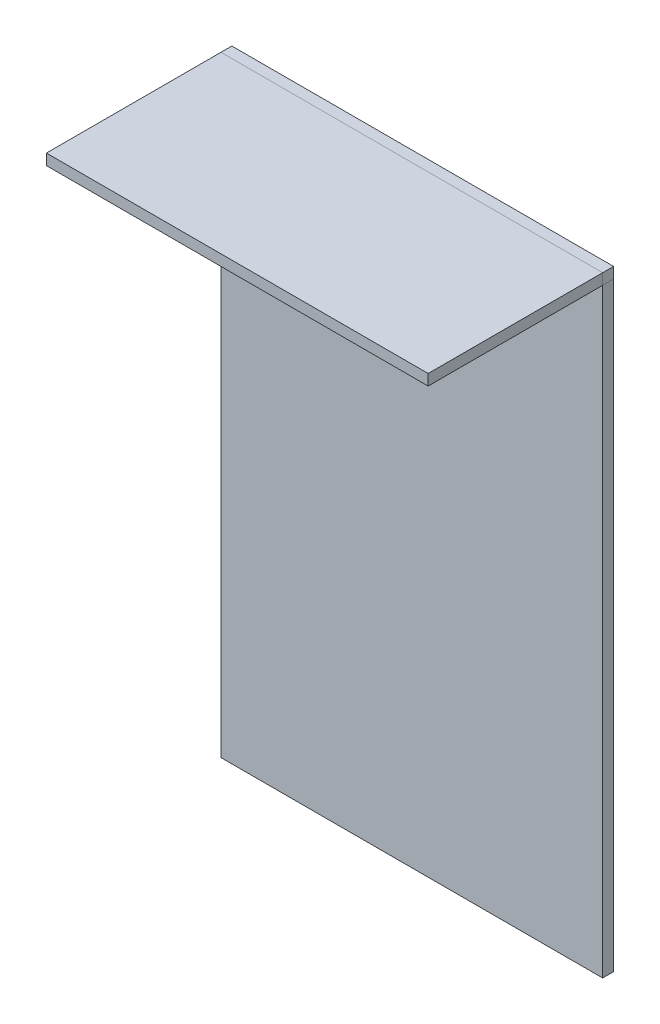
ISO-10303-21;
HEADER;
FILE_DESCRIPTION(('STEP AP214'),'2;1');
FILE_NAME('part.step','',(''),(''),'','','');
FILE_SCHEMA(('AUTOMOTIVE_DESIGN { 1 0 10303 214 1 1 1 1 }'));
ENDSEC;
DATA;
#1=APPLICATION_CONTEXT('core data for automotive mechanical design processes');
#2=APPLICATION_PROTOCOL_DEFINITION('international standard','automotive_design',2000,#1);
#3=PRODUCT_CONTEXT('',#1,'mechanical');
#4=PRODUCT('Part','Part','',(#3));
#5=PRODUCT_RELATED_PRODUCT_CATEGORY('part','',(#4));
#6=PRODUCT_DEFINITION_FORMATION('','',#4);
#7=PRODUCT_DEFINITION_CONTEXT('part definition',#1,'design');
#8=PRODUCT_DEFINITION('design','',#6,#7);
#9=PRODUCT_DEFINITION_SHAPE('','',#8);
#10=(LENGTH_UNIT() NAMED_UNIT(*) SI_UNIT(.MILLI.,.METRE.));
#11=(NAMED_UNIT(*) PLANE_ANGLE_UNIT() SI_UNIT($,.RADIAN.));
#12=(NAMED_UNIT(*) SI_UNIT($,.STERADIAN.) SOLID_ANGLE_UNIT());
#13=UNCERTAINTY_MEASURE_WITH_UNIT(LENGTH_MEASURE(1.E-05),#10,'distance_accuracy_value','');
#14=(GEOMETRIC_REPRESENTATION_CONTEXT(3) GLOBAL_UNCERTAINTY_ASSIGNED_CONTEXT((#13)) GLOBAL_UNIT_ASSIGNED_CONTEXT((#10,
#11,#12)) REPRESENTATION_CONTEXT('',''));
#15=CARTESIAN_POINT('',(0.,0.,0.));
#16=DIRECTION('',(0.,0.,1.));
#17=DIRECTION('',(1.,0.,0.));
#18=AXIS2_PLACEMENT_3D('',#15,#16,#17);
#19=CARTESIAN_POINT('',(51.627560854272,18.840471400111,0.));
#20=DIRECTION('',(1.74845552913497E-07,-0.999999999999985,0.));
#21=DIRECTION('',(0.,0.,-1.));
#22=AXIS2_PLACEMENT_3D('',#19,#20,#21);
#23=PLANE('',#22);
#24=DIRECTION('',(0.999999999999985,1.74845552913497E-07,0.));
#25=VECTOR('',#24,1.);
#26=CARTESIAN_POINT('',(51.627560854272,18.840471400111,0.17));
#27=LINE('',#26,#25);
#28=CARTESIAN_POINT('',(51.627560854272,18.840471400111,0.17));
#29=VERTEX_POINT('',#28);
#30=CARTESIAN_POINT('',(51.977560854272,18.840471461307,0.17));
#31=VERTEX_POINT('',#30);
#32=EDGE_CURVE('E11',#29,#31,#27,.T.);
#33=ORIENTED_EDGE('',*,*,#32,.T.);
#34=DIRECTION('',(0.,0.,-1.));
#35=VECTOR('',#34,1.);
#36=CARTESIAN_POINT('',(51.977560854272,18.840471461307,0.17));
#37=LINE('',#36,#35);
#38=CARTESIAN_POINT('',(51.977560854272,18.840471461307,0.01));
#39=VERTEX_POINT('',#38);
#40=EDGE_CURVE('E20',#31,#39,#37,.T.);
#41=ORIENTED_EDGE('',*,*,#40,.T.);
#42=DIRECTION('',(-0.999999999999985,-1.74845552913497E-07,0.));
#43=VECTOR('',#42,1.);
#44=CARTESIAN_POINT('',(51.977560854272,18.840471461307,0.01));
#45=LINE('',#44,#43);
#46=CARTESIAN_POINT('',(51.627560854272,18.840471400111,0.01));
#47=VERTEX_POINT('',#46);
#48=EDGE_CURVE('E186',#39,#47,#45,.T.);
#49=ORIENTED_EDGE('',*,*,#48,.T.);
#50=DIRECTION('',(0.,0.,1.));
#51=VECTOR('',#50,1.);
#52=CARTESIAN_POINT('',(51.627560854272,18.840471400111,0.));
#53=LINE('',#52,#51);
#54=EDGE_CURVE('E189',#47,#29,#53,.T.);
#55=ORIENTED_EDGE('',*,*,#54,.T.);
#56=EDGE_LOOP('',(#33,#41,#49,#55));
#57=FACE_BOUND('',#56,.T.);
#58=ADVANCED_FACE('F16',(#57),#23,.F.);
#59=CARTESIAN_POINT('',(51.627560856021,18.830471400111,0.17));
#60=DIRECTION('',(0.,0.,-1.));
#61=DIRECTION('',(0.,-1.,0.));
#62=AXIS2_PLACEMENT_3D('',#59,#60,#61);
#63=PLANE('',#62);
#64=DIRECTION('',(0.999999999999985,1.74845552913497E-07,0.));
#65=VECTOR('',#64,1.);
#66=CARTESIAN_POINT('',(51.627560856021,18.830471400111,0.17));
#67=LINE('',#66,#65);
#68=CARTESIAN_POINT('',(51.627560856021,18.830471400111,0.17));
#69=VERTEX_POINT('',#68);
#70=CARTESIAN_POINT('',(51.977560856021,18.830471461307,0.17));
#71=VERTEX_POINT('',#70);
#72=EDGE_CURVE('E108',#69,#71,#67,.T.);
#73=ORIENTED_EDGE('',*,*,#72,.T.);
#74=DIRECTION('',(-1.74845552913497E-07,0.999999999999985,0.));
#75=VECTOR('',#74,1.);
#76=CARTESIAN_POINT('',(51.977560856021,18.830471461307,0.17));
#77=LINE('',#76,#75);
#78=EDGE_CURVE('E27',#71,#31,#77,.T.);
#79=ORIENTED_EDGE('',*,*,#78,.T.);
#80=ORIENTED_EDGE('',*,*,#32,.F.);
#81=DIRECTION('',(-1.74845552913497E-07,0.999999999999985,0.));
#82=VECTOR('',#81,1.);
#83=CARTESIAN_POINT('',(51.627560856021,18.830471400111,0.17));
#84=LINE('',#83,#82);
#85=EDGE_CURVE('E158',#69,#29,#84,.T.);
#86=ORIENTED_EDGE('',*,*,#85,.F.);
#87=EDGE_LOOP('',(#73,#79,#80,#86));
#88=FACE_BOUND('',#87,.T.);
#89=ADVANCED_FACE('F18',(#88),#63,.F.);
#90=CARTESIAN_POINT('',(51.977560856021,18.830471461307,0.17));
#91=DIRECTION('',(-0.999999999999985,-1.74845552913497E-07,0.));
#92=DIRECTION('',(-1.74845552913497E-07,0.999999999999985,0.));
#93=AXIS2_PLACEMENT_3D('',#90,#91,#92);
#94=PLANE('',#93);
#95=DIRECTION('',(-1.74845552913497E-07,0.999999999999985,0.));
#96=VECTOR('',#95,1.);
#97=CARTESIAN_POINT('',(51.977560952186,18.280471461307,0.01));
#98=LINE('',#97,#96);
#99=CARTESIAN_POINT('',(51.977560856021,18.830471461307,0.01));
#100=VERTEX_POINT('',#99);
#101=EDGE_CURVE('E101',#100,#39,#98,.T.);
#102=ORIENTED_EDGE('',*,*,#101,.T.);
#103=ORIENTED_EDGE('',*,*,#40,.F.);
#104=ORIENTED_EDGE('',*,*,#78,.F.);
#105=DIRECTION('',(0.,0.,-1.));
#106=VECTOR('',#105,1.);
#107=CARTESIAN_POINT('',(51.977560856021,18.830471461307,0.17));
#108=LINE('',#107,#106);
#109=EDGE_CURVE('E97',#71,#100,#108,.T.);
#110=ORIENTED_EDGE('',*,*,#109,.T.);
#111=EDGE_LOOP('',(#102,#103,#104,#110));
#112=FACE_BOUND('',#111,.T.);
#113=ADVANCED_FACE('F99',(#112),#94,.F.);
#114=CARTESIAN_POINT('',(51.977560854272,18.840471461307,0.));
#115=DIRECTION('',(1.74845552913497E-07,-0.999999999999985,0.));
#116=DIRECTION('',(0.,0.,-1.));
#117=AXIS2_PLACEMENT_3D('',#114,#115,#116);
#118=PLANE('',#117);
#119=DIRECTION('',(-0.999999999999985,-1.74845552913497E-07,0.));
#120=VECTOR('',#119,1.);
#121=CARTESIAN_POINT('',(51.977560854272,18.840471461307,0.));
#122=LINE('',#121,#120);
#123=CARTESIAN_POINT('',(51.977560854272,18.840471461307,0.));
#124=VERTEX_POINT('',#123);
#125=CARTESIAN_POINT('',(51.627560854272,18.840471400111,0.));
#126=VERTEX_POINT('',#125);
#127=EDGE_CURVE('E120',#124,#126,#122,.T.);
#128=ORIENTED_EDGE('',*,*,#127,.T.);
#129=DIRECTION('',(0.,0.,1.));
#130=VECTOR('',#129,1.);
#131=CARTESIAN_POINT('',(51.627560854272,18.840471400111,0.));
#132=LINE('',#131,#130);
#133=EDGE_CURVE('E174',#126,#47,#132,.T.);
#134=ORIENTED_EDGE('',*,*,#133,.T.);
#135=ORIENTED_EDGE('',*,*,#48,.F.);
#136=DIRECTION('',(0.,0.,1.));
#137=VECTOR('',#136,1.);
#138=CARTESIAN_POINT('',(51.977560854272,18.840471461307,0.));
#139=LINE('',#138,#137);
#140=EDGE_CURVE('E118',#124,#39,#139,.T.);
#141=ORIENTED_EDGE('',*,*,#140,.F.);
#142=EDGE_LOOP('',(#128,#134,#135,#141));
#143=FACE_BOUND('',#142,.T.);
#144=ADVANCED_FACE('F235',(#143),#118,.F.);
#145=CARTESIAN_POINT('',(51.627560856021,18.830471400111,0.));
#146=DIRECTION('',(0.999999999999985,1.74845552913497E-07,0.));
#147=DIRECTION('',(0.,0.,-1.));
#148=AXIS2_PLACEMENT_3D('',#145,#146,#147);
#149=PLANE('',#148);
#150=ORIENTED_EDGE('',*,*,#85,.T.);
#151=ORIENTED_EDGE('',*,*,#54,.F.);
#152=DIRECTION('',(1.74845552913497E-07,-0.999999999999985,0.));
#153=VECTOR('',#152,1.);
#154=CARTESIAN_POINT('',(51.627560854272,18.840471400111,0.01));
#155=LINE('',#154,#153);
#156=CARTESIAN_POINT('',(51.627560856021,18.830471400111,0.01));
#157=VERTEX_POINT('',#156);
#158=EDGE_CURVE('E132',#47,#157,#155,.T.);
#159=ORIENTED_EDGE('',*,*,#158,.T.);
#160=DIRECTION('',(0.,0.,1.));
#161=VECTOR('',#160,1.);
#162=CARTESIAN_POINT('',(51.627560856021,18.830471400111,0.));
#163=LINE('',#162,#161);
#164=EDGE_CURVE('E109',#157,#69,#163,.T.);
#165=ORIENTED_EDGE('',*,*,#164,.T.);
#166=EDGE_LOOP('',(#150,#151,#159,#165));
#167=FACE_BOUND('',#166,.T.);
#168=ADVANCED_FACE('F204',(#167),#149,.F.);
#169=CARTESIAN_POINT('',(51.627560856021,18.830471400111,0.));
#170=DIRECTION('',(1.74845552913497E-07,-0.999999999999985,0.));
#171=DIRECTION('',(0.,0.,-1.));
#172=AXIS2_PLACEMENT_3D('',#169,#170,#171);
#173=PLANE('',#172);
#174=ORIENTED_EDGE('',*,*,#164,.F.);
#175=DIRECTION('',(-0.999999999999985,-1.74845552913497E-07,0.));
#176=VECTOR('',#175,1.);
#177=CARTESIAN_POINT('',(51.627560856021,18.830471400111,0.01));
#178=LINE('',#177,#176);
#179=EDGE_CURVE('E124',#100,#157,#178,.T.);
#180=ORIENTED_EDGE('',*,*,#179,.F.);
#181=ORIENTED_EDGE('',*,*,#109,.F.);
#182=ORIENTED_EDGE('',*,*,#72,.F.);
#183=EDGE_LOOP('',(#174,#180,#181,#182));
#184=FACE_BOUND('',#183,.T.);
#185=ADVANCED_FACE('F126',(#184),#173,.T.);
#186=CARTESIAN_POINT('',(51.627560854272,18.840471400111,0.));
#187=DIRECTION('',(0.,0.,-1.));
#188=DIRECTION('',(0.,-1.,0.));
#189=AXIS2_PLACEMENT_3D('',#186,#187,#188);
#190=PLANE('',#189);
#191=DIRECTION('',(-0.999999999999985,-1.74845552913497E-07,0.));
#192=VECTOR('',#191,1.);
#193=CARTESIAN_POINT('',(51.977560856021,18.830471461307,0.));
#194=LINE('',#193,#192);
#195=CARTESIAN_POINT('',(51.977560856021,18.830471461307,0.));
#196=VERTEX_POINT('',#195);
#197=CARTESIAN_POINT('',(51.627560856021,18.830471400111,0.));
#198=VERTEX_POINT('',#197);
#199=EDGE_CURVE('E133',#196,#198,#194,.T.);
#200=ORIENTED_EDGE('',*,*,#199,.T.);
#201=DIRECTION('',(-1.74845552913497E-07,0.999999999999985,0.));
#202=VECTOR('',#201,1.);
#203=CARTESIAN_POINT('',(51.627560856021,18.830471400111,0.));
#204=LINE('',#203,#202);
#205=EDGE_CURVE('E178',#198,#126,#204,.T.);
#206=ORIENTED_EDGE('',*,*,#205,.T.);
#207=ORIENTED_EDGE('',*,*,#127,.F.);
#208=DIRECTION('',(-1.74845552913497E-07,0.999999999999985,0.));
#209=VECTOR('',#208,1.);
#210=CARTESIAN_POINT('',(51.977560856021,18.830471461307,0.));
#211=LINE('',#210,#209);
#212=EDGE_CURVE('E179',#196,#124,#211,.T.);
#213=ORIENTED_EDGE('',*,*,#212,.F.);
#214=EDGE_LOOP('',(#200,#206,#207,#213));
#215=FACE_BOUND('',#214,.T.);
#216=ADVANCED_FACE('F237',(#215),#190,.T.);
#217=CARTESIAN_POINT('',(51.977560856021,18.830471461307,0.17));
#218=DIRECTION('',(-0.999999999999985,-1.74845552913497E-07,0.));
#219=DIRECTION('',(-1.74845552913497E-07,0.999999999999985,0.));
#220=AXIS2_PLACEMENT_3D('',#217,#218,#219);
#221=PLANE('',#220);
#222=ORIENTED_EDGE('',*,*,#212,.T.);
#223=ORIENTED_EDGE('',*,*,#140,.T.);
#224=ORIENTED_EDGE('',*,*,#101,.F.);
#225=DIRECTION('',(0.,0.,-1.));
#226=VECTOR('',#225,1.);
#227=CARTESIAN_POINT('',(51.977560856021,18.830471461307,0.17));
#228=LINE('',#227,#226);
#229=EDGE_CURVE('E116',#100,#196,#228,.T.);
#230=ORIENTED_EDGE('',*,*,#229,.T.);
#231=EDGE_LOOP('',(#222,#223,#224,#230));
#232=FACE_BOUND('',#231,.T.);
#233=ADVANCED_FACE('F114',(#232),#221,.F.);
#234=CARTESIAN_POINT('',(51.627560856021,18.830471400111,0.));
#235=DIRECTION('',(0.999999999999985,1.74845552913497E-07,0.));
#236=DIRECTION('',(0.,0.,-1.));
#237=AXIS2_PLACEMENT_3D('',#234,#235,#236);
#238=PLANE('',#237);
#239=ORIENTED_EDGE('',*,*,#158,.F.);
#240=ORIENTED_EDGE('',*,*,#133,.F.);
#241=ORIENTED_EDGE('',*,*,#205,.F.);
#242=DIRECTION('',(0.,0.,1.));
#243=VECTOR('',#242,1.);
#244=CARTESIAN_POINT('',(51.627560856021,18.830471400111,0.));
#245=LINE('',#244,#243);
#246=EDGE_CURVE('E155',#198,#157,#245,.T.);
#247=ORIENTED_EDGE('',*,*,#246,.T.);
#248=EDGE_LOOP('',(#239,#240,#241,#247));
#249=FACE_BOUND('',#248,.T.);
#250=ADVANCED_FACE('F207',(#249),#238,.F.);
#251=CARTESIAN_POINT('',(51.627560854272,18.840471400111,0.01));
#252=DIRECTION('',(0.,0.,-1.));
#253=DIRECTION('',(0.,-1.,0.));
#254=AXIS2_PLACEMENT_3D('',#251,#252,#253);
#255=PLANE('',#254);
#256=DIRECTION('',(0.999999999999985,1.74845552913497E-07,0.));
#257=VECTOR('',#256,1.);
#258=CARTESIAN_POINT('',(51.627560952186,18.280471400111,0.01));
#259=LINE('',#258,#257);
#260=CARTESIAN_POINT('',(51.627560952186,18.280471400111,0.01));
#261=VERTEX_POINT('',#260);
#262=CARTESIAN_POINT('',(51.977560952186,18.280471461307,0.01));
#263=VERTEX_POINT('',#262);
#264=EDGE_CURVE('E139',#261,#263,#259,.T.);
#265=ORIENTED_EDGE('',*,*,#264,.T.);
#266=DIRECTION('',(-1.74845552913497E-07,0.999999999999985,0.));
#267=VECTOR('',#266,1.);
#268=CARTESIAN_POINT('',(51.977560952186,18.280471461307,0.01));
#269=LINE('',#268,#267);
#270=EDGE_CURVE('E136',#263,#100,#269,.T.);
#271=ORIENTED_EDGE('',*,*,#270,.T.);
#272=ORIENTED_EDGE('',*,*,#179,.T.);
#273=DIRECTION('',(1.74845552913497E-07,-0.999999999999985,0.));
#274=VECTOR('',#273,1.);
#275=CARTESIAN_POINT('',(51.627560854272,18.840471400111,0.01));
#276=LINE('',#275,#274);
#277=EDGE_CURVE('E173',#157,#261,#276,.T.);
#278=ORIENTED_EDGE('',*,*,#277,.T.);
#279=EDGE_LOOP('',(#265,#271,#272,#278));
#280=FACE_BOUND('',#279,.T.);
#281=ADVANCED_FACE('F137',(#280),#255,.F.);
#282=CARTESIAN_POINT('',(51.627560854272,18.840471400111,0.));
#283=DIRECTION('',(0.,0.,-1.));
#284=DIRECTION('',(0.,-1.,0.));
#285=AXIS2_PLACEMENT_3D('',#282,#283,#284);
#286=PLANE('',#285);
#287=DIRECTION('',(1.74845552913497E-07,-0.999999999999985,0.));
#288=VECTOR('',#287,1.);
#289=CARTESIAN_POINT('',(51.627560854272,18.840471400111,0.));
#290=LINE('',#289,#288);
#291=CARTESIAN_POINT('',(51.627560952186,18.280471400111,0.));
#292=VERTEX_POINT('',#291);
#293=EDGE_CURVE('E149',#198,#292,#290,.T.);
#294=ORIENTED_EDGE('',*,*,#293,.F.);
#295=ORIENTED_EDGE('',*,*,#199,.F.);
#296=DIRECTION('',(-1.74845552913497E-07,0.999999999999985,0.));
#297=VECTOR('',#296,1.);
#298=CARTESIAN_POINT('',(51.977560952186,18.280471461307,0.));
#299=LINE('',#298,#297);
#300=CARTESIAN_POINT('',(51.977560952186,18.280471461307,0.));
#301=VERTEX_POINT('',#300);
#302=EDGE_CURVE('E144',#301,#196,#299,.T.);
#303=ORIENTED_EDGE('',*,*,#302,.F.);
#304=DIRECTION('',(0.999999999999985,1.74845552913497E-07,0.));
#305=VECTOR('',#304,1.);
#306=CARTESIAN_POINT('',(51.627560952186,18.280471400111,0.));
#307=LINE('',#306,#305);
#308=EDGE_CURVE('E164',#292,#301,#307,.T.);
#309=ORIENTED_EDGE('',*,*,#308,.F.);
#310=EDGE_LOOP('',(#294,#295,#303,#309));
#311=FACE_BOUND('',#310,.T.);
#312=ADVANCED_FACE('F242',(#311),#286,.T.);
#313=CARTESIAN_POINT('',(51.977560952186,18.280471461307,0.));
#314=DIRECTION('',(-0.999999999999985,-1.74845552913497E-07,0.));
#315=DIRECTION('',(-1.74845552913497E-07,0.999999999999985,0.));
#316=AXIS2_PLACEMENT_3D('',#313,#314,#315);
#317=PLANE('',#316);
#318=ORIENTED_EDGE('',*,*,#229,.F.);
#319=ORIENTED_EDGE('',*,*,#270,.F.);
#320=DIRECTION('',(0.,0.,1.));
#321=VECTOR('',#320,1.);
#322=CARTESIAN_POINT('',(51.977560952186,18.280471461307,0.));
#323=LINE('',#322,#321);
#324=EDGE_CURVE('E161',#301,#263,#323,.T.);
#325=ORIENTED_EDGE('',*,*,#324,.F.);
#326=ORIENTED_EDGE('',*,*,#302,.T.);
#327=EDGE_LOOP('',(#318,#319,#325,#326));
#328=FACE_BOUND('',#327,.T.);
#329=ADVANCED_FACE('F147',(#328),#317,.F.);
#330=CARTESIAN_POINT('',(51.627560854272,18.840471400111,0.));
#331=DIRECTION('',(0.999999999999985,1.74845552913497E-07,0.));
#332=DIRECTION('',(0.,0.,-1.));
#333=AXIS2_PLACEMENT_3D('',#330,#331,#332);
#334=PLANE('',#333);
#335=DIRECTION('',(0.,0.,1.));
#336=VECTOR('',#335,1.);
#337=CARTESIAN_POINT('',(51.627560952186,18.280471400111,0.));
#338=LINE('',#337,#336);
#339=EDGE_CURVE('E170',#292,#261,#338,.T.);
#340=ORIENTED_EDGE('',*,*,#339,.T.);
#341=ORIENTED_EDGE('',*,*,#277,.F.);
#342=ORIENTED_EDGE('',*,*,#246,.F.);
#343=ORIENTED_EDGE('',*,*,#293,.T.);
#344=EDGE_LOOP('',(#340,#341,#342,#343));
#345=FACE_BOUND('',#344,.T.);
#346=ADVANCED_FACE('F212',(#345),#334,.F.);
#347=CARTESIAN_POINT('',(51.627560952186,18.280471400111,0.));
#348=DIRECTION('',(-1.74845552913497E-07,0.999999999999985,0.));
#349=DIRECTION('',(0.,0.,1.));
#350=AXIS2_PLACEMENT_3D('',#347,#348,#349);
#351=PLANE('',#350);
#352=ORIENTED_EDGE('',*,*,#308,.T.);
#353=ORIENTED_EDGE('',*,*,#324,.T.);
#354=ORIENTED_EDGE('',*,*,#264,.F.);
#355=ORIENTED_EDGE('',*,*,#339,.F.);
#356=EDGE_LOOP('',(#352,#353,#354,#355));
#357=FACE_BOUND('',#356,.T.);
#358=ADVANCED_FACE('F244',(#357),#351,.F.);
#359=CLOSED_SHELL('',(#58,#89,#113,#144,#168,#185,#216,#233,#250,#281,#312,#329,#346,#358));
#360=MANIFOLD_SOLID_BREP('B1',#359);
#361=ADVANCED_BREP_SHAPE_REPRESENTATION('',(#18,#360),#14);
#362=SHAPE_DEFINITION_REPRESENTATION(#9,#361);
ENDSEC;
END-ISO-10303-21;
